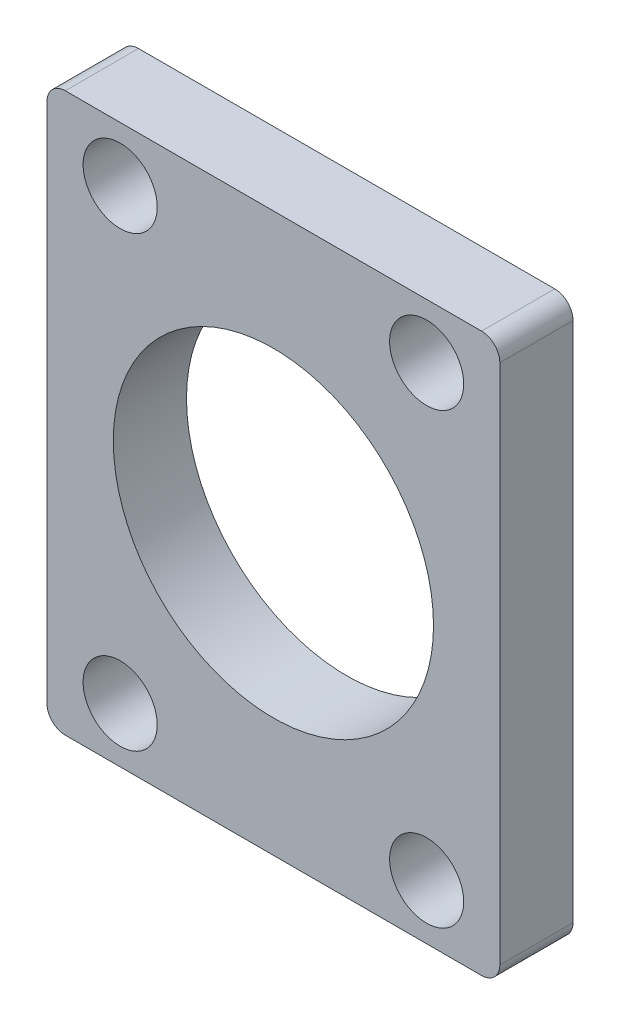
ISO-10303-21;
HEADER;
FILE_DESCRIPTION(('STEP AP214'),'2;1');
FILE_NAME('part.step','',(''),(''),'','','');
FILE_SCHEMA(('AUTOMOTIVE_DESIGN { 1 0 10303 214 1 1 1 1 }'));
ENDSEC;
DATA;
#1=APPLICATION_CONTEXT('core data for automotive mechanical design processes');
#2=APPLICATION_PROTOCOL_DEFINITION('international standard','automotive_design',2000,#1);
#3=PRODUCT_CONTEXT('',#1,'mechanical');
#4=PRODUCT('Part','Part','',(#3));
#5=PRODUCT_RELATED_PRODUCT_CATEGORY('part','',(#4));
#6=PRODUCT_DEFINITION_FORMATION('','',#4);
#7=PRODUCT_DEFINITION_CONTEXT('part definition',#1,'design');
#8=PRODUCT_DEFINITION('design','',#6,#7);
#9=PRODUCT_DEFINITION_SHAPE('','',#8);
#10=(LENGTH_UNIT() NAMED_UNIT(*) SI_UNIT(.MILLI.,.METRE.));
#11=(NAMED_UNIT(*) PLANE_ANGLE_UNIT() SI_UNIT($,.RADIAN.));
#12=(NAMED_UNIT(*) SI_UNIT($,.STERADIAN.) SOLID_ANGLE_UNIT());
#13=UNCERTAINTY_MEASURE_WITH_UNIT(LENGTH_MEASURE(1.E-05),#10,'distance_accuracy_value','');
#14=(GEOMETRIC_REPRESENTATION_CONTEXT(3) GLOBAL_UNCERTAINTY_ASSIGNED_CONTEXT((#13)) GLOBAL_UNIT_ASSIGNED_CONTEXT((#10,
#11,#12)) REPRESENTATION_CONTEXT('',''));
#15=CARTESIAN_POINT('',(0.,0.,0.));
#16=DIRECTION('',(0.,0.,1.));
#17=DIRECTION('',(1.,0.,0.));
#18=AXIS2_PLACEMENT_3D('',#15,#16,#17);
#19=CARTESIAN_POINT('',(0.,-40.,8.));
#20=DIRECTION('',(0.,1.,0.));
#21=DIRECTION('',(0.,0.,1.));
#22=AXIS2_PLACEMENT_3D('',#19,#20,#21);
#23=PLANE('',#22);
#24=DIRECTION('',(1.,0.,0.));
#25=VECTOR('',#24,1.);
#26=CARTESIAN_POINT('',(0.,-40.,0.));
#27=LINE('',#26,#25);
#28=CARTESIAN_POINT('',(-398.582040950373,-40.,0.));
#29=VERTEX_POINT('',#28);
#30=CARTESIAN_POINT('',(-353.082040950373,-40.,0.));
#31=VERTEX_POINT('',#30);
#32=EDGE_CURVE('E109',#29,#31,#27,.T.);
#33=ORIENTED_EDGE('',*,*,#32,.T.);
#34=DIRECTION('',(0.,0.,-1.));
#35=VECTOR('',#34,1.);
#36=CARTESIAN_POINT('',(-353.082040950373,-40.,8.));
#37=LINE('',#36,#35);
#38=CARTESIAN_POINT('',(-353.082040950373,-40.,8.));
#39=VERTEX_POINT('',#38);
#40=EDGE_CURVE('E11',#31,#39,#37,.F.);
#41=ORIENTED_EDGE('',*,*,#40,.T.);
#42=DIRECTION('',(1.,0.,0.));
#43=VECTOR('',#42,1.);
#44=CARTESIAN_POINT('',(0.,-40.,8.));
#45=LINE('',#44,#43);
#46=CARTESIAN_POINT('',(-398.582040950373,-40.,8.));
#47=VERTEX_POINT('',#46);
#48=EDGE_CURVE('E183',#47,#39,#45,.T.);
#49=ORIENTED_EDGE('',*,*,#48,.F.);
#50=DIRECTION('',(0.,0.,-1.));
#51=VECTOR('',#50,1.);
#52=CARTESIAN_POINT('',(-398.582040950373,-40.,0.));
#53=LINE('',#52,#51);
#54=EDGE_CURVE('E45',#47,#29,#53,.T.);
#55=ORIENTED_EDGE('',*,*,#54,.T.);
#56=EDGE_LOOP('',(#33,#41,#49,#55));
#57=FACE_BOUND('',#56,.T.);
#58=ADVANCED_FACE('F36',(#57),#23,.F.);
#59=CARTESIAN_POINT('',(-351.082040950373,0.,8.));
#60=DIRECTION('',(-1.,0.,0.));
#61=DIRECTION('',(0.,0.,1.));
#62=AXIS2_PLACEMENT_3D('',#59,#60,#61);
#63=PLANE('',#62);
#64=DIRECTION('',(0.,1.,0.));
#65=VECTOR('',#64,1.);
#66=CARTESIAN_POINT('',(-351.082040950373,0.,0.));
#67=LINE('',#66,#65);
#68=CARTESIAN_POINT('',(-351.082040950373,-38.,0.));
#69=VERTEX_POINT('',#68);
#70=CARTESIAN_POINT('',(-351.082040950373,19.,0.));
#71=VERTEX_POINT('',#70);
#72=EDGE_CURVE('E192',#69,#71,#67,.T.);
#73=ORIENTED_EDGE('',*,*,#72,.T.);
#74=DIRECTION('',(0.,0.,-1.));
#75=VECTOR('',#74,1.);
#76=CARTESIAN_POINT('',(-351.082040950373,19.,8.));
#77=LINE('',#76,#75);
#78=CARTESIAN_POINT('',(-351.082040950373,19.,8.));
#79=VERTEX_POINT('',#78);
#80=EDGE_CURVE('E53',#71,#79,#77,.F.);
#81=ORIENTED_EDGE('',*,*,#80,.T.);
#82=DIRECTION('',(0.,1.,0.));
#83=VECTOR('',#82,1.);
#84=CARTESIAN_POINT('',(-351.082040950373,0.,8.));
#85=LINE('',#84,#83);
#86=CARTESIAN_POINT('',(-351.082040950373,-38.,8.));
#87=VERTEX_POINT('',#86);
#88=EDGE_CURVE('E185',#87,#79,#85,.T.);
#89=ORIENTED_EDGE('',*,*,#88,.F.);
#90=DIRECTION('',(0.,0.,-1.));
#91=VECTOR('',#90,1.);
#92=CARTESIAN_POINT('',(-351.082040950373,-38.,8.));
#93=LINE('',#92,#91);
#94=EDGE_CURVE('E152',#87,#69,#93,.T.);
#95=ORIENTED_EDGE('',*,*,#94,.T.);
#96=EDGE_LOOP('',(#73,#81,#89,#95));
#97=FACE_BOUND('',#96,.T.);
#98=ADVANCED_FACE('F218',(#97),#63,.F.);
#99=CARTESIAN_POINT('',(0.,21.,8.));
#100=DIRECTION('',(0.,1.,0.));
#101=DIRECTION('',(0.,0.,1.));
#102=AXIS2_PLACEMENT_3D('',#99,#100,#101);
#103=PLANE('',#102);
#104=DIRECTION('',(1.,0.,0.));
#105=VECTOR('',#104,1.);
#106=CARTESIAN_POINT('',(0.,21.,0.));
#107=LINE('',#106,#105);
#108=CARTESIAN_POINT('',(-398.582040950373,21.,0.));
#109=VERTEX_POINT('',#108);
#110=CARTESIAN_POINT('',(-353.082040950373,21.,0.));
#111=VERTEX_POINT('',#110);
#112=EDGE_CURVE('E125',#109,#111,#107,.T.);
#113=ORIENTED_EDGE('',*,*,#112,.F.);
#114=DIRECTION('',(0.,0.,-1.));
#115=VECTOR('',#114,1.);
#116=CARTESIAN_POINT('',(-398.582040950373,21.,8.));
#117=LINE('',#116,#115);
#118=CARTESIAN_POINT('',(-398.582040950373,21.,8.));
#119=VERTEX_POINT('',#118);
#120=EDGE_CURVE('E144',#109,#119,#117,.F.);
#121=ORIENTED_EDGE('',*,*,#120,.T.);
#122=DIRECTION('',(1.,0.,0.));
#123=VECTOR('',#122,1.);
#124=CARTESIAN_POINT('',(0.,21.,8.));
#125=LINE('',#124,#123);
#126=CARTESIAN_POINT('',(-353.082040950373,21.,8.));
#127=VERTEX_POINT('',#126);
#128=EDGE_CURVE('E132',#119,#127,#125,.T.);
#129=ORIENTED_EDGE('',*,*,#128,.T.);
#130=DIRECTION('',(0.,0.,-1.));
#131=VECTOR('',#130,1.);
#132=CARTESIAN_POINT('',(-353.082040950373,21.,0.));
#133=LINE('',#132,#131);
#134=EDGE_CURVE('E141',#127,#111,#133,.T.);
#135=ORIENTED_EDGE('',*,*,#134,.T.);
#136=EDGE_LOOP('',(#113,#121,#129,#135));
#137=FACE_BOUND('',#136,.T.);
#138=ADVANCED_FACE('F198',(#137),#103,.T.);
#139=CARTESIAN_POINT('',(-375.832040950373,-9.50000000000002,8.));
#140=DIRECTION('',(0.,0.,-1.));
#141=DIRECTION('',(-1.,0.,0.));
#142=AXIS2_PLACEMENT_3D('',#139,#140,#141);
#143=CYLINDRICAL_SURFACE('',#142,17.5);
#144=CARTESIAN_POINT('',(-375.832040950373,-9.50000000000002,8.));
#145=DIRECTION('',(0.,0.,1.));
#146=DIRECTION('',(1.,0.,0.));
#147=AXIS2_PLACEMENT_3D('',#144,#145,#146);
#148=CIRCLE('',#147,17.5);
#149=CARTESIAN_POINT('',(-358.332040950373,-9.50000000000002,8.));
#150=VERTEX_POINT('',#149);
#151=EDGE_CURVE('E124',#150,#150,#148,.T.);
#152=ORIENTED_EDGE('',*,*,#151,.T.);
#153=EDGE_LOOP('',(#152));
#154=FACE_BOUND('',#153,.T.);
#155=CARTESIAN_POINT('',(-375.832040950373,-9.50000000000002,0.));
#156=DIRECTION('',(0.,0.,1.));
#157=DIRECTION('',(1.,0.,0.));
#158=AXIS2_PLACEMENT_3D('',#155,#156,#157);
#159=CIRCLE('',#158,17.5);
#160=CARTESIAN_POINT('',(-358.332040950373,-9.50000000000002,0.));
#161=VERTEX_POINT('',#160);
#162=EDGE_CURVE('E180',#161,#161,#159,.T.);
#163=ORIENTED_EDGE('',*,*,#162,.F.);
#164=EDGE_LOOP('',(#163));
#165=FACE_BOUND('',#164,.T.);
#166=ADVANCED_FACE('F227',(#154,#165),#143,.F.);
#167=CARTESIAN_POINT('',(-400.582040950373,0.,8.));
#168=DIRECTION('',(-1.,0.,0.));
#169=DIRECTION('',(0.,0.,1.));
#170=AXIS2_PLACEMENT_3D('',#167,#168,#169);
#171=PLANE('',#170);
#172=DIRECTION('',(0.,1.,0.));
#173=VECTOR('',#172,1.);
#174=CARTESIAN_POINT('',(-400.582040950373,0.,8.));
#175=LINE('',#174,#173);
#176=CARTESIAN_POINT('',(-400.582040950373,-38.,8.));
#177=VERTEX_POINT('',#176);
#178=CARTESIAN_POINT('',(-400.582040950373,19.,8.));
#179=VERTEX_POINT('',#178);
#180=EDGE_CURVE('E129',#177,#179,#175,.T.);
#181=ORIENTED_EDGE('',*,*,#180,.T.);
#182=DIRECTION('',(0.,0.,-1.));
#183=VECTOR('',#182,1.);
#184=CARTESIAN_POINT('',(-400.582040950373,19.,8.));
#185=LINE('',#184,#183);
#186=CARTESIAN_POINT('',(-400.582040950373,19.,0.));
#187=VERTEX_POINT('',#186);
#188=EDGE_CURVE('E115',#179,#187,#185,.T.);
#189=ORIENTED_EDGE('',*,*,#188,.T.);
#190=DIRECTION('',(0.,1.,0.));
#191=VECTOR('',#190,1.);
#192=CARTESIAN_POINT('',(-400.582040950373,0.,0.));
#193=LINE('',#192,#191);
#194=CARTESIAN_POINT('',(-400.582040950373,-38.,0.));
#195=VERTEX_POINT('',#194);
#196=EDGE_CURVE('E107',#195,#187,#193,.T.);
#197=ORIENTED_EDGE('',*,*,#196,.F.);
#198=DIRECTION('',(0.,0.,-1.));
#199=VECTOR('',#198,1.);
#200=CARTESIAN_POINT('',(-400.582040950373,-38.,8.));
#201=LINE('',#200,#199);
#202=EDGE_CURVE('E121',#195,#177,#201,.F.);
#203=ORIENTED_EDGE('',*,*,#202,.T.);
#204=EDGE_LOOP('',(#181,#189,#197,#203));
#205=FACE_BOUND('',#204,.T.);
#206=ADVANCED_FACE('F120',(#205),#171,.T.);
#207=CARTESIAN_POINT('',(0.,0.,8.));
#208=DIRECTION('',(0.,0.,1.));
#209=DIRECTION('',(1.,0.,0.));
#210=AXIS2_PLACEMENT_3D('',#207,#208,#209);
#211=PLANE('',#210);
#212=CARTESIAN_POINT('',(-359.082040950373,15.,8.));
#213=DIRECTION('',(0.,0.,1.));
#214=DIRECTION('',(1.,0.,0.));
#215=AXIS2_PLACEMENT_3D('',#212,#213,#214);
#216=CIRCLE('',#215,4.05000000000002);
#217=CARTESIAN_POINT('',(-355.032040950373,15.,8.));
#218=VERTEX_POINT('',#217);
#219=EDGE_CURVE('E177',#218,#218,#216,.T.);
#220=ORIENTED_EDGE('',*,*,#219,.F.);
#221=EDGE_LOOP('',(#220));
#222=FACE_BOUND('',#221,.T.);
#223=CARTESIAN_POINT('',(-392.582040950373,15.,8.));
#224=DIRECTION('',(0.,0.,1.));
#225=DIRECTION('',(1.,0.,0.));
#226=AXIS2_PLACEMENT_3D('',#223,#224,#225);
#227=CIRCLE('',#226,4.05000000000002);
#228=CARTESIAN_POINT('',(-388.532040950373,15.,8.));
#229=VERTEX_POINT('',#228);
#230=EDGE_CURVE('E166',#229,#229,#227,.T.);
#231=ORIENTED_EDGE('',*,*,#230,.F.);
#232=EDGE_LOOP('',(#231));
#233=FACE_BOUND('',#232,.T.);
#234=CARTESIAN_POINT('',(-392.582040950373,-34.,8.));
#235=DIRECTION('',(0.,0.,1.));
#236=DIRECTION('',(1.,0.,0.));
#237=AXIS2_PLACEMENT_3D('',#234,#235,#236);
#238=CIRCLE('',#237,4.05000000000002);
#239=CARTESIAN_POINT('',(-388.532040950373,-34.,8.));
#240=VERTEX_POINT('',#239);
#241=EDGE_CURVE('E163',#240,#240,#238,.T.);
#242=ORIENTED_EDGE('',*,*,#241,.F.);
#243=EDGE_LOOP('',(#242));
#244=FACE_BOUND('',#243,.T.);
#245=CARTESIAN_POINT('',(-359.082040950373,-34.,8.));
#246=DIRECTION('',(0.,0.,1.));
#247=DIRECTION('',(1.,0.,0.));
#248=AXIS2_PLACEMENT_3D('',#245,#246,#247);
#249=CIRCLE('',#248,4.05000000000002);
#250=CARTESIAN_POINT('',(-355.032040950373,-34.,8.));
#251=VERTEX_POINT('',#250);
#252=EDGE_CURVE('E160',#251,#251,#249,.T.);
#253=ORIENTED_EDGE('',*,*,#252,.F.);
#254=EDGE_LOOP('',(#253));
#255=FACE_BOUND('',#254,.T.);
#256=ORIENTED_EDGE('',*,*,#151,.F.);
#257=EDGE_LOOP('',(#256));
#258=FACE_BOUND('',#257,.T.);
#259=ORIENTED_EDGE('',*,*,#128,.F.);
#260=CARTESIAN_POINT('',(-398.582040950373,19.,8.));
#261=DIRECTION('',(0.,0.,1.));
#262=DIRECTION('',(1.,0.,0.));
#263=AXIS2_PLACEMENT_3D('',#260,#261,#262);
#264=CIRCLE('',#263,2.);
#265=EDGE_CURVE('E150',#119,#179,#264,.T.);
#266=ORIENTED_EDGE('',*,*,#265,.T.);
#267=ORIENTED_EDGE('',*,*,#180,.F.);
#268=CARTESIAN_POINT('',(-398.582040950373,-38.,8.));
#269=DIRECTION('',(0.,0.,1.));
#270=DIRECTION('',(1.,0.,0.));
#271=AXIS2_PLACEMENT_3D('',#268,#269,#270);
#272=CIRCLE('',#271,2.);
#273=EDGE_CURVE('E128',#177,#47,#272,.T.);
#274=ORIENTED_EDGE('',*,*,#273,.T.);
#275=ORIENTED_EDGE('',*,*,#48,.T.);
#276=CARTESIAN_POINT('',(-353.082040950373,-38.,8.));
#277=DIRECTION('',(0.,0.,1.));
#278=DIRECTION('',(1.,0.,0.));
#279=AXIS2_PLACEMENT_3D('',#276,#277,#278);
#280=CIRCLE('',#279,2.);
#281=EDGE_CURVE('E60',#39,#87,#280,.T.);
#282=ORIENTED_EDGE('',*,*,#281,.T.);
#283=ORIENTED_EDGE('',*,*,#88,.T.);
#284=CARTESIAN_POINT('',(-353.082040950373,19.,8.));
#285=DIRECTION('',(0.,0.,1.));
#286=DIRECTION('',(1.,0.,0.));
#287=AXIS2_PLACEMENT_3D('',#284,#285,#286);
#288=CIRCLE('',#287,2.);
#289=EDGE_CURVE('E148',#79,#127,#288,.T.);
#290=ORIENTED_EDGE('',*,*,#289,.T.);
#291=EDGE_LOOP('',(#259,#266,#267,#274,#275,#282,#283,#290));
#292=FACE_BOUND('',#291,.T.);
#293=ADVANCED_FACE('F204',(#222,#233,#244,#255,#258,#292),#211,.T.);
#294=CARTESIAN_POINT('',(0.,0.,0.));
#295=DIRECTION('',(0.,0.,1.));
#296=DIRECTION('',(1.,0.,0.));
#297=AXIS2_PLACEMENT_3D('',#294,#295,#296);
#298=PLANE('',#297);
#299=CARTESIAN_POINT('',(-359.082040950373,15.,0.));
#300=DIRECTION('',(0.,0.,1.));
#301=DIRECTION('',(1.,0.,0.));
#302=AXIS2_PLACEMENT_3D('',#299,#300,#301);
#303=CIRCLE('',#302,4.05000000000002);
#304=CARTESIAN_POINT('',(-355.032040950373,15.,0.));
#305=VERTEX_POINT('',#304);
#306=EDGE_CURVE('E40',#305,#305,#303,.T.);
#307=ORIENTED_EDGE('',*,*,#306,.T.);
#308=EDGE_LOOP('',(#307));
#309=FACE_BOUND('',#308,.T.);
#310=CARTESIAN_POINT('',(-392.582040950373,15.,0.));
#311=DIRECTION('',(0.,0.,1.));
#312=DIRECTION('',(1.,0.,0.));
#313=AXIS2_PLACEMENT_3D('',#310,#311,#312);
#314=CIRCLE('',#313,4.05000000000002);
#315=CARTESIAN_POINT('',(-388.532040950373,15.,0.));
#316=VERTEX_POINT('',#315);
#317=EDGE_CURVE('E164',#316,#316,#314,.T.);
#318=ORIENTED_EDGE('',*,*,#317,.T.);
#319=EDGE_LOOP('',(#318));
#320=FACE_BOUND('',#319,.T.);
#321=CARTESIAN_POINT('',(-392.582040950373,-34.,0.));
#322=DIRECTION('',(0.,0.,1.));
#323=DIRECTION('',(1.,0.,0.));
#324=AXIS2_PLACEMENT_3D('',#321,#322,#323);
#325=CIRCLE('',#324,4.05000000000002);
#326=CARTESIAN_POINT('',(-388.532040950373,-34.,0.));
#327=VERTEX_POINT('',#326);
#328=EDGE_CURVE('E161',#327,#327,#325,.T.);
#329=ORIENTED_EDGE('',*,*,#328,.T.);
#330=EDGE_LOOP('',(#329));
#331=FACE_BOUND('',#330,.T.);
#332=CARTESIAN_POINT('',(-359.082040950373,-34.,0.));
#333=DIRECTION('',(0.,0.,1.));
#334=DIRECTION('',(1.,0.,0.));
#335=AXIS2_PLACEMENT_3D('',#332,#333,#334);
#336=CIRCLE('',#335,4.05000000000002);
#337=CARTESIAN_POINT('',(-355.032040950373,-34.,0.));
#338=VERTEX_POINT('',#337);
#339=EDGE_CURVE('E157',#338,#338,#336,.T.);
#340=ORIENTED_EDGE('',*,*,#339,.T.);
#341=EDGE_LOOP('',(#340));
#342=FACE_BOUND('',#341,.T.);
#343=ORIENTED_EDGE('',*,*,#162,.T.);
#344=EDGE_LOOP('',(#343));
#345=FACE_BOUND('',#344,.T.);
#346=ORIENTED_EDGE('',*,*,#196,.T.);
#347=CARTESIAN_POINT('',(-398.582040950373,19.,0.));
#348=DIRECTION('',(0.,0.,1.));
#349=DIRECTION('',(1.,0.,0.));
#350=AXIS2_PLACEMENT_3D('',#347,#348,#349);
#351=CIRCLE('',#350,2.);
#352=EDGE_CURVE('E139',#187,#109,#351,.F.);
#353=ORIENTED_EDGE('',*,*,#352,.T.);
#354=ORIENTED_EDGE('',*,*,#112,.T.);
#355=CARTESIAN_POINT('',(-353.082040950373,19.,0.));
#356=DIRECTION('',(0.,0.,1.));
#357=DIRECTION('',(1.,0.,0.));
#358=AXIS2_PLACEMENT_3D('',#355,#356,#357);
#359=CIRCLE('',#358,2.);
#360=EDGE_CURVE('E137',#111,#71,#359,.F.);
#361=ORIENTED_EDGE('',*,*,#360,.T.);
#362=ORIENTED_EDGE('',*,*,#72,.F.);
#363=CARTESIAN_POINT('',(-353.082040950373,-38.,0.));
#364=DIRECTION('',(0.,0.,1.));
#365=DIRECTION('',(1.,0.,0.));
#366=AXIS2_PLACEMENT_3D('',#363,#364,#365);
#367=CIRCLE('',#366,2.);
#368=EDGE_CURVE('E114',#69,#31,#367,.F.);
#369=ORIENTED_EDGE('',*,*,#368,.T.);
#370=ORIENTED_EDGE('',*,*,#32,.F.);
#371=CARTESIAN_POINT('',(-398.582040950373,-38.,0.));
#372=DIRECTION('',(0.,0.,1.));
#373=DIRECTION('',(1.,0.,0.));
#374=AXIS2_PLACEMENT_3D('',#371,#372,#373);
#375=CIRCLE('',#374,2.);
#376=EDGE_CURVE('E104',#29,#195,#375,.F.);
#377=ORIENTED_EDGE('',*,*,#376,.T.);
#378=EDGE_LOOP('',(#346,#353,#354,#361,#362,#369,#370,#377));
#379=FACE_BOUND('',#378,.T.);
#380=ADVANCED_FACE('F106',(#309,#320,#331,#342,#345,#379),#298,.F.);
#381=CARTESIAN_POINT('',(-398.582040950373,19.,8.));
#382=DIRECTION('',(0.,0.,-1.));
#383=DIRECTION('',(-1.,0.,0.));
#384=AXIS2_PLACEMENT_3D('',#381,#382,#383);
#385=CYLINDRICAL_SURFACE('',#384,2.);
#386=ORIENTED_EDGE('',*,*,#265,.F.);
#387=ORIENTED_EDGE('',*,*,#120,.F.);
#388=ORIENTED_EDGE('',*,*,#352,.F.);
#389=ORIENTED_EDGE('',*,*,#188,.F.);
#390=EDGE_LOOP('',(#386,#387,#388,#389));
#391=FACE_BOUND('',#390,.T.);
#392=ADVANCED_FACE('F203',(#391),#385,.T.);
#393=CARTESIAN_POINT('',(-353.082040950373,19.,8.));
#394=DIRECTION('',(0.,0.,1.));
#395=DIRECTION('',(1.,0.,0.));
#396=AXIS2_PLACEMENT_3D('',#393,#394,#395);
#397=CYLINDRICAL_SURFACE('',#396,2.);
#398=ORIENTED_EDGE('',*,*,#289,.F.);
#399=ORIENTED_EDGE('',*,*,#80,.F.);
#400=ORIENTED_EDGE('',*,*,#360,.F.);
#401=ORIENTED_EDGE('',*,*,#134,.F.);
#402=EDGE_LOOP('',(#398,#399,#400,#401));
#403=FACE_BOUND('',#402,.T.);
#404=ADVANCED_FACE('F207',(#403),#397,.T.);
#405=CARTESIAN_POINT('',(-353.082040950373,-38.,8.));
#406=DIRECTION('',(0.,0.,-1.));
#407=DIRECTION('',(-1.,0.,0.));
#408=AXIS2_PLACEMENT_3D('',#405,#406,#407);
#409=CYLINDRICAL_SURFACE('',#408,2.);
#410=ORIENTED_EDGE('',*,*,#281,.F.);
#411=ORIENTED_EDGE('',*,*,#40,.F.);
#412=ORIENTED_EDGE('',*,*,#368,.F.);
#413=ORIENTED_EDGE('',*,*,#94,.F.);
#414=EDGE_LOOP('',(#410,#411,#412,#413));
#415=FACE_BOUND('',#414,.T.);
#416=ADVANCED_FACE('F209',(#415),#409,.T.);
#417=CARTESIAN_POINT('',(-398.582040950373,-38.,8.));
#418=DIRECTION('',(0.,0.,1.));
#419=DIRECTION('',(1.,0.,0.));
#420=AXIS2_PLACEMENT_3D('',#417,#418,#419);
#421=CYLINDRICAL_SURFACE('',#420,2.);
#422=ORIENTED_EDGE('',*,*,#273,.F.);
#423=ORIENTED_EDGE('',*,*,#202,.F.);
#424=ORIENTED_EDGE('',*,*,#376,.F.);
#425=ORIENTED_EDGE('',*,*,#54,.F.);
#426=EDGE_LOOP('',(#422,#423,#424,#425));
#427=FACE_BOUND('',#426,.T.);
#428=ADVANCED_FACE('F38',(#427),#421,.T.);
#429=CARTESIAN_POINT('',(-359.082040950373,-34.,-10.000000000003));
#430=DIRECTION('',(0.,0.,1.));
#431=DIRECTION('',(1.,0.,0.));
#432=AXIS2_PLACEMENT_3D('',#429,#430,#431);
#433=CYLINDRICAL_SURFACE('',#432,4.05000000000002);
#434=ORIENTED_EDGE('',*,*,#252,.T.);
#435=EDGE_LOOP('',(#434));
#436=FACE_BOUND('',#435,.T.);
#437=ORIENTED_EDGE('',*,*,#339,.F.);
#438=EDGE_LOOP('',(#437));
#439=FACE_BOUND('',#438,.T.);
#440=ADVANCED_FACE('F249',(#436,#439),#433,.F.);
#441=CARTESIAN_POINT('',(-392.582040950373,-34.,-10.000000000003));
#442=DIRECTION('',(0.,0.,1.));
#443=DIRECTION('',(1.,0.,0.));
#444=AXIS2_PLACEMENT_3D('',#441,#442,#443);
#445=CYLINDRICAL_SURFACE('',#444,4.05000000000002);
#446=ORIENTED_EDGE('',*,*,#241,.T.);
#447=EDGE_LOOP('',(#446));
#448=FACE_BOUND('',#447,.T.);
#449=ORIENTED_EDGE('',*,*,#328,.F.);
#450=EDGE_LOOP('',(#449));
#451=FACE_BOUND('',#450,.T.);
#452=ADVANCED_FACE('F252',(#448,#451),#445,.F.);
#453=CARTESIAN_POINT('',(-392.582040950373,15.,-10.000000000003));
#454=DIRECTION('',(0.,0.,1.));
#455=DIRECTION('',(1.,0.,0.));
#456=AXIS2_PLACEMENT_3D('',#453,#454,#455);
#457=CYLINDRICAL_SURFACE('',#456,4.05000000000002);
#458=ORIENTED_EDGE('',*,*,#230,.T.);
#459=EDGE_LOOP('',(#458));
#460=FACE_BOUND('',#459,.T.);
#461=ORIENTED_EDGE('',*,*,#317,.F.);
#462=EDGE_LOOP('',(#461));
#463=FACE_BOUND('',#462,.T.);
#464=ADVANCED_FACE('F257',(#460,#463),#457,.F.);
#465=CARTESIAN_POINT('',(-359.082040950373,15.,-10.000000000003));
#466=DIRECTION('',(0.,0.,1.));
#467=DIRECTION('',(1.,0.,0.));
#468=AXIS2_PLACEMENT_3D('',#465,#466,#467);
#469=CYLINDRICAL_SURFACE('',#468,4.05000000000002);
#470=ORIENTED_EDGE('',*,*,#219,.T.);
#471=EDGE_LOOP('',(#470));
#472=FACE_BOUND('',#471,.T.);
#473=ORIENTED_EDGE('',*,*,#306,.F.);
#474=EDGE_LOOP('',(#473));
#475=FACE_BOUND('',#474,.T.);
#476=ADVANCED_FACE('F254',(#472,#475),#469,.F.);
#477=CLOSED_SHELL('',(#58,#98,#138,#166,#206,#293,#380,#392,#404,#416,#428,#440,#452,#464,#476));
#478=MANIFOLD_SOLID_BREP('B2',#477);
#479=ADVANCED_BREP_SHAPE_REPRESENTATION('',(#18,#478),#14);
#480=SHAPE_DEFINITION_REPRESENTATION(#9,#479);
ENDSEC;
END-ISO-10303-21;
